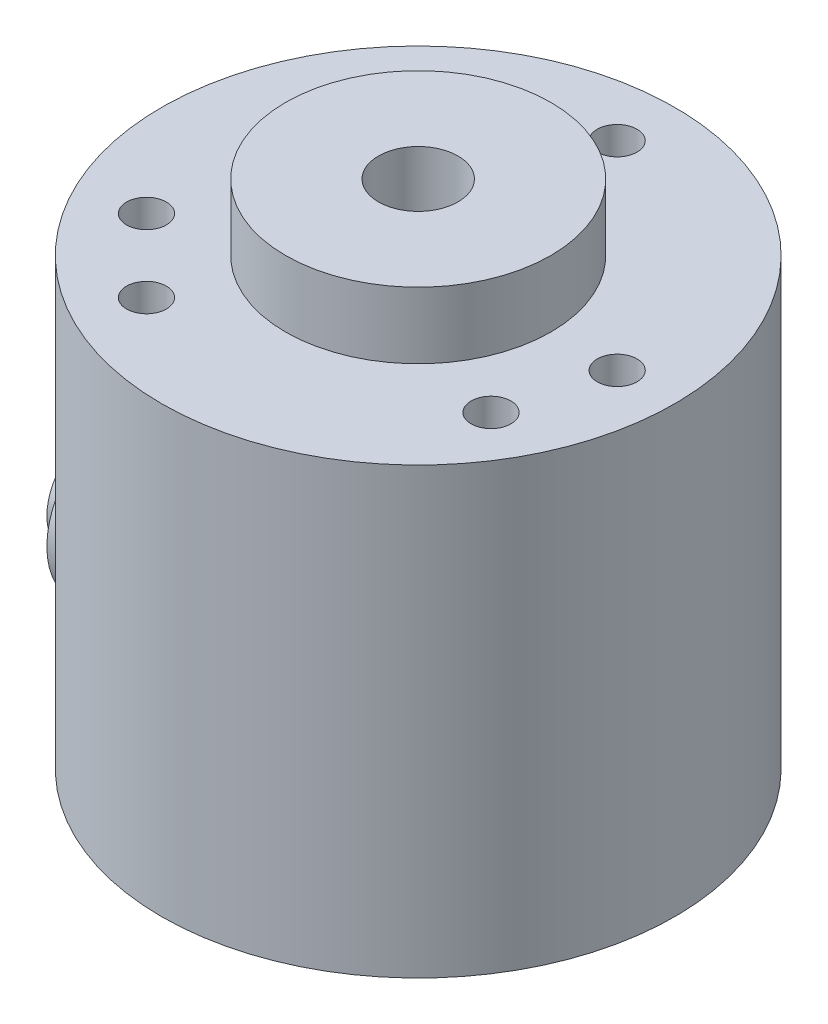
ISO-10303-21;
HEADER;
FILE_DESCRIPTION(('STEP AP214'),'2;1');
FILE_NAME('part.step','',(''),(''),'','','');
FILE_SCHEMA(('AUTOMOTIVE_DESIGN { 1 0 10303 214 1 1 1 1 }'));
ENDSEC;
DATA;
#1=APPLICATION_CONTEXT('core data for automotive mechanical design processes');
#2=APPLICATION_PROTOCOL_DEFINITION('international standard','automotive_design',2000,#1);
#3=PRODUCT_CONTEXT('',#1,'mechanical');
#4=PRODUCT('Part','Part','',(#3));
#5=PRODUCT_RELATED_PRODUCT_CATEGORY('part','',(#4));
#6=PRODUCT_DEFINITION_FORMATION('','',#4);
#7=PRODUCT_DEFINITION_CONTEXT('part definition',#1,'design');
#8=PRODUCT_DEFINITION('design','',#6,#7);
#9=PRODUCT_DEFINITION_SHAPE('','',#8);
#10=(LENGTH_UNIT() NAMED_UNIT(*) SI_UNIT(.MILLI.,.METRE.));
#11=(NAMED_UNIT(*) PLANE_ANGLE_UNIT() SI_UNIT($,.RADIAN.));
#12=(NAMED_UNIT(*) SI_UNIT($,.STERADIAN.) SOLID_ANGLE_UNIT());
#13=UNCERTAINTY_MEASURE_WITH_UNIT(LENGTH_MEASURE(1.E-05),#10,'distance_accuracy_value','');
#14=(GEOMETRIC_REPRESENTATION_CONTEXT(3) GLOBAL_UNCERTAINTY_ASSIGNED_CONTEXT((#13)) GLOBAL_UNIT_ASSIGNED_CONTEXT((#10,
#11,#12)) REPRESENTATION_CONTEXT('',''));
#15=CARTESIAN_POINT('',(0.,0.,0.));
#16=DIRECTION('',(0.,0.,1.));
#17=DIRECTION('',(1.,0.,0.));
#18=AXIS2_PLACEMENT_3D('',#15,#16,#17);
#19=CARTESIAN_POINT('',(0.,33.5,0.));
#20=DIRECTION('',(0.,-1.,0.));
#21=DIRECTION('',(0.,0.,-1.));
#22=AXIS2_PLACEMENT_3D('',#19,#20,#21);
#23=CYLINDRICAL_SURFACE('',#22,19.35);
#24=CARTESIAN_POINT('',(0.,33.5,0.));
#25=DIRECTION('',(0.,1.,0.));
#26=DIRECTION('',(0.,0.,1.));
#27=AXIS2_PLACEMENT_3D('',#24,#25,#26);
#28=CIRCLE('',#27,19.35);
#29=CARTESIAN_POINT('',(0.,33.5,19.35));
#30=VERTEX_POINT('',#29);
#31=EDGE_CURVE('E143',#30,#30,#28,.T.);
#32=ORIENTED_EDGE('',*,*,#31,.F.);
#33=EDGE_LOOP('',(#32));
#34=FACE_BOUND('',#33,.T.);
#35=CARTESIAN_POINT('',(0.,0.,0.));
#36=DIRECTION('',(0.,1.,0.));
#37=DIRECTION('',(0.,0.,1.));
#38=AXIS2_PLACEMENT_3D('',#35,#36,#37);
#39=CIRCLE('',#38,19.35);
#40=CARTESIAN_POINT('',(0.,0.,19.35));
#41=VERTEX_POINT('',#40);
#42=EDGE_CURVE('E139',#41,#41,#39,.T.);
#43=ORIENTED_EDGE('',*,*,#42,.T.);
#44=EDGE_LOOP('',(#43));
#45=FACE_BOUND('',#44,.T.);
#46=CARTESIAN_POINT('',(-18.3962632075104,6.5,6.));
#47=CARTESIAN_POINT('',(-18.396254948903,6.66417537004088,6.00001200529961));
#48=CARTESIAN_POINT('',(-18.3984651787003,6.8282454922487,5.9932604335798));
#49=CARTESIAN_POINT('',(-18.4072021365173,7.15519058262896,5.96637390385622));
#50=CARTESIAN_POINT('',(-18.4137291149144,7.31806548092261,5.94623816955152));
#51=CARTESIAN_POINT('',(-18.4395431290745,7.80307644137202,5.86593181871231));
#52=CARTESIAN_POINT('',(-18.4650636275965,8.121822583843,5.78586177226993));
#53=CARTESIAN_POINT('',(-18.5295806773833,8.74000419218241,5.57575313884579));
#54=CARTESIAN_POINT('',(-18.568553654058,9.03947235932613,5.44580192102297));
#55=CARTESIAN_POINT('',(-18.6555780280091,9.61260508691605,5.13975524381697));
#56=CARTESIAN_POINT('',(-18.7036309814575,9.8862652121807,4.96365187264122));
#57=CARTESIAN_POINT('',(-18.7793790352446,10.2761910269336,4.66565821293452));
#58=CARTESIAN_POINT('',(-18.8056668522791,10.4045135119431,4.55879891422907));
#59=CARTESIAN_POINT('',(-18.8585562269517,10.6517697615802,4.33481114272108));
#60=CARTESIAN_POINT('',(-18.8851576759668,10.7707066730199,4.21768613986108));
#61=CARTESIAN_POINT('',(-18.9379702475309,10.9985011549647,3.97383350483335));
#62=CARTESIAN_POINT('',(-18.9641811688197,11.1073536696047,3.84710111322587));
#63=CARTESIAN_POINT('',(-19.0154874240988,11.3141762714007,3.58490894986138));
#64=CARTESIAN_POINT('',(-19.0405831675409,11.4121503728405,3.44945242677941));
#65=CARTESIAN_POINT('',(-19.0895453488805,11.5986790109119,3.16744332694732));
#66=CARTESIAN_POINT('',(-19.1133709591726,11.6869692923059,3.02070868841922));
#67=CARTESIAN_POINT('',(-19.1584785361738,11.8507944074864,2.71998257769279));
#68=CARTESIAN_POINT('',(-19.1797614994372,11.9263342434527,2.56599398179304));
#69=CARTESIAN_POINT('',(-19.2191901764665,12.0640929447953,2.25173475929984));
#70=CARTESIAN_POINT('',(-19.2373351722515,12.1263087623509,2.09146270528627));
#71=CARTESIAN_POINT('',(-19.2699467294521,12.2368228242638,1.76589915912679));
#72=CARTESIAN_POINT('',(-19.2844149014037,12.2851271634178,1.60060990027504));
#73=CARTESIAN_POINT('',(-19.3088822968719,12.366164182969,1.27122516811284));
#74=CARTESIAN_POINT('',(-19.319002722112,12.3993210834394,1.10724301653924));
#75=CARTESIAN_POINT('',(-19.335102231438,12.4518320148317,0.776946530009174));
#76=CARTESIAN_POINT('',(-19.3410829828291,12.4711916028864,0.610633161547876));
#77=CARTESIAN_POINT('',(-19.3487391362864,12.4959440446351,0.276871426616334));
#78=CARTESIAN_POINT('',(-19.3504145425522,12.5013369119527,0.10942306125336));
#79=CARTESIAN_POINT('',(-19.349411905323,12.4981033706454,-0.225323468576094));
#80=CARTESIAN_POINT('',(-19.346733947728,12.4894772386411,-0.392621635941084));
#81=CARTESIAN_POINT('',(-19.3372669646729,12.4588250285184,-0.720080273127005));
#82=CARTESIAN_POINT('',(-19.3306217910395,12.4372677124184,-0.880289052068062));
#83=CARTESIAN_POINT('',(-19.3135169193132,12.3813386633211,-1.19830261973268));
#84=CARTESIAN_POINT('',(-19.3030559247748,12.3469625749891,-1.35610657239783));
#85=CARTESIAN_POINT('',(-19.2785982797616,12.2657046960965,-1.66812206542651));
#86=CARTESIAN_POINT('',(-19.2646027785349,12.218826970178,-1.82233475572503));
#87=CARTESIAN_POINT('',(-19.2334307746976,12.1129243271526,-2.12626151889554));
#88=CARTESIAN_POINT('',(-19.2162530750231,12.0538948379222,-2.27597387413932));
#89=CARTESIAN_POINT('',(-19.1789398049399,11.9233924766832,-2.57162004275753));
#90=CARTESIAN_POINT('',(-19.1587718621077,11.8517815921342,-2.71748881991415));
#91=CARTESIAN_POINT('',(-19.1161424092667,11.6971075664252,-3.00273298736432));
#92=CARTESIAN_POINT('',(-19.0936801135214,11.6140404984852,-3.14210612917045));
#93=CARTESIAN_POINT('',(-19.0470373631021,11.4370454937236,-3.41347701634848));
#94=CARTESIAN_POINT('',(-19.0228568489797,11.3431171810442,-3.54547450624832));
#95=CARTESIAN_POINT('',(-18.9733876175992,11.1450119054833,-3.80132115155472));
#96=CARTESIAN_POINT('',(-18.9480988656793,11.0408346219231,-3.92517005179866));
#97=CARTESIAN_POINT('',(-18.8959961338342,10.8183721835087,-4.16893268920621));
#98=CARTESIAN_POINT('',(-18.8691622812171,10.6996822197743,-4.28847304741261));
#99=CARTESIAN_POINT('',(-18.8157305868405,10.4526886304147,-4.5171416116123));
#100=CARTESIAN_POINT('',(-18.7891326724702,10.3243880860075,-4.62627312945854));
#101=CARTESIAN_POINT('',(-18.7368931770166,10.0588778615293,-4.83350403248794));
#102=CARTESIAN_POINT('',(-18.7112520687233,9.92166386645302,-4.93159801066302));
#103=CARTESIAN_POINT('',(-18.6616827005478,9.6393004889139,-5.11597616085845));
#104=CARTESIAN_POINT('',(-18.6377537755539,9.49415422687769,-5.20226493072066));
#105=CARTESIAN_POINT('',(-18.5920443458392,9.19512259769266,-5.36334592829184));
#106=CARTESIAN_POINT('',(-18.5702912164425,9.04115692577398,-5.43799701340734));
#107=CARTESIAN_POINT('',(-18.5299307133209,8.72712025173839,-5.5739752333766));
#108=CARTESIAN_POINT('',(-18.511322111085,8.5670516640174,-5.63530757430916));
#109=CARTESIAN_POINT('',(-18.4778410104203,8.24190993074761,-5.74413931778635));
#110=CARTESIAN_POINT('',(-18.4629681841243,8.07683722580682,-5.79163993431847));
#111=CARTESIAN_POINT('',(-18.4374520874409,7.74291741183855,-5.87236382870318));
#112=CARTESIAN_POINT('',(-18.4268086334969,7.57407046695071,-5.90558772617654));
#113=CARTESIAN_POINT('',(-18.410446134938,7.24069792323786,-5.95639618891658));
#114=CARTESIAN_POINT('',(-18.4045479657689,7.07626777887199,-5.97455054841904));
#115=CARTESIAN_POINT('',(-18.3971725878539,6.74631091124739,-5.99722310048295));
#116=CARTESIAN_POINT('',(-18.3956969039167,6.58078382949017,-6.00173658987553));
#117=CARTESIAN_POINT('',(-18.3972185033893,6.25002936635444,-5.99707067716109));
#118=CARTESIAN_POINT('',(-18.4002134982106,6.08480187495574,-5.98789828100756));
#119=CARTESIAN_POINT('',(-18.4105775118924,5.75574360442561,-5.95595642415295));
#120=CARTESIAN_POINT('',(-18.4179481479883,5.59191336443901,-5.93318193610512));
#121=CARTESIAN_POINT('',(-18.4365569254616,5.27160224335456,-5.87509722903779));
#122=CARTESIAN_POINT('',(-18.4476777414986,5.11504550453641,-5.84016637320586));
#123=CARTESIAN_POINT('',(-18.4734997139824,4.80545052581438,-5.75796517046525));
#124=CARTESIAN_POINT('',(-18.4882021408717,4.65241355554415,-5.71069044460148));
#125=CARTESIAN_POINT('',(-18.5207585282576,4.35094164169144,-5.60420373617969));
#126=CARTESIAN_POINT('',(-18.538611745803,4.20250562289144,-5.5449945672766));
#127=CARTESIAN_POINT('',(-18.5769810778139,3.91106105088298,-5.41505877897731));
#128=CARTESIAN_POINT('',(-18.5974981480293,3.76805446959002,-5.34432802348004));
#129=CARTESIAN_POINT('',(-18.6412438772546,3.48443103608206,-5.189716650557));
#130=CARTESIAN_POINT('',(-18.6645325789748,3.34399457304887,-5.10552209176353));
#131=CARTESIAN_POINT('',(-18.7126914984098,3.07065200225845,-4.9260839746664));
#132=CARTESIAN_POINT('',(-18.7375617711206,2.93774615666688,-4.83084003204853));
#133=CARTESIAN_POINT('',(-18.788224909642,2.68020358563239,-4.62988583843478));
#134=CARTESIAN_POINT('',(-18.8140181213318,2.55557001132072,-4.52417163681805));
#135=CARTESIAN_POINT('',(-18.8658318800139,2.3154019949827,-4.30299687180302));
#136=CARTESIAN_POINT('',(-18.8918523533,2.19986471627549,-4.18753937031102));
#137=CARTESIAN_POINT('',(-18.9445180961712,1.97398387955301,-3.94259570352941));
#138=CARTESIAN_POINT('',(-18.9711450323348,1.86404951764978,-3.81272781705758));
#139=CARTESIAN_POINT('',(-19.0231736013317,1.65553654441889,-3.54402089204944));
#140=CARTESIAN_POINT('',(-19.0485756698562,1.55695387765948,-3.40518508517582));
#141=CARTESIAN_POINT('',(-19.0974669632191,1.37177169675549,-3.11934029590192));
#142=CARTESIAN_POINT('',(-19.1209554687993,1.28517667998197,-2.9723282748938));
#143=CARTESIAN_POINT('',(-19.1653398646657,1.12471423846154,-2.67121579305387));
#144=CARTESIAN_POINT('',(-19.1862368309126,1.0508415266565,-2.51711831065112));
#145=CARTESIAN_POINT('',(-19.2247193790604,0.916862377818753,-2.20394558587916));
#146=CARTESIAN_POINT('',(-19.2423271948601,0.856662866973248,-2.04491292347666));
#147=CARTESIAN_POINT('',(-19.2739035600918,0.749916594538959,-1.72204452771519));
#148=CARTESIAN_POINT('',(-19.2878735623184,0.703364381838333,-1.55821074090085));
#149=CARTESIAN_POINT('',(-19.311778371148,0.624312397758581,-1.22690517053723));
#150=CARTESIAN_POINT('',(-19.3217134014161,0.591811847466743,-1.05943358917903));
#151=CARTESIAN_POINT('',(-19.3372572330195,0.541174605984937,-0.722135799377492));
#152=CARTESIAN_POINT('',(-19.3428661908677,0.5230373951434,-0.552309676345374));
#153=CARTESIAN_POINT('',(-19.3494539635469,0.501753239703157,-0.218670186747859));
#154=CARTESIAN_POINT('',(-19.3506141328141,0.49801911573299,-0.0548975815705274));
#155=CARTESIAN_POINT('',(-19.3487744375475,0.50395289128672,0.272439030238904));
#156=CARTESIAN_POINT('',(-19.3457731505526,0.51362537343109,0.436002946406095));
#157=CARTESIAN_POINT('',(-19.3356921749298,0.546284186194804,0.761594765711806));
#158=CARTESIAN_POINT('',(-19.3286142658401,0.569264707576776,0.923623307726984));
#159=CARTESIAN_POINT('',(-19.310570290588,0.628337943368595,1.2451129184919));
#160=CARTESIAN_POINT('',(-19.2996027728023,0.664435553271838,1.40457300542112));
#161=CARTESIAN_POINT('',(-19.274235542107,0.748890952451233,1.71776610218174));
#162=CARTESIAN_POINT('',(-19.2598806846842,0.797088999150475,1.87154589656528));
#163=CARTESIAN_POINT('',(-19.2280332171048,0.905587578441697,2.17449951761089));
#164=CARTESIAN_POINT('',(-19.2105394802423,0.965892457728167,2.3236716677401));
#165=CARTESIAN_POINT('',(-19.1728671578455,1.09811626889547,2.61637842015561));
#166=CARTESIAN_POINT('',(-19.1526892043363,1.17003246762718,2.75991433927457));
#167=CARTESIAN_POINT('',(-19.1101437872282,1.32499782561854,3.04056938773939));
#168=CARTESIAN_POINT('',(-19.0877754962391,1.40805119630645,3.17768606311041));
#169=CARTESIAN_POINT('',(-19.0406375756321,1.58765516784183,3.4490881471848));
#170=CARTESIAN_POINT('',(-19.015812885917,1.68456225252474,3.58312854113504));
#171=CARTESIAN_POINT('',(-18.9650735149456,1.88899983084006,3.84265547317531));
#172=CARTESIAN_POINT('',(-18.9391584305068,1.99653427420545,3.96813880146716));
#173=CARTESIAN_POINT('',(-18.8608031181945,2.33403366776519,4.33053796879568));
#174=CARTESIAN_POINT('',(-18.8077160463606,2.57902931951566,4.55360586273766));
#175=CARTESIAN_POINT('',(-18.7038596461145,3.11150005961589,4.96331328351969));
#176=CARTESIAN_POINT('',(-18.6532215419244,3.40009614390194,5.1485348240421));
#177=CARTESIAN_POINT('',(-18.5849684365144,3.85404571261181,5.3877908088131));
#178=CARTESIAN_POINT('',(-18.5634964686937,4.00891787372372,5.46112857085053));
#179=CARTESIAN_POINT('',(-18.5237604674547,4.32475304960708,5.594429893224));
#180=CARTESIAN_POINT('',(-18.5054962312538,4.4857156785762,5.65439429904547));
#181=CARTESIAN_POINT('',(-18.4742507757006,4.79784717787475,5.75561596963127));
#182=CARTESIAN_POINT('',(-18.4609422412813,4.94859576266175,5.79807030839954));
#183=CARTESIAN_POINT('',(-18.4378375413789,5.25319954578542,5.87112206005744));
#184=CARTESIAN_POINT('',(-18.4280423123621,5.40705556087646,5.90171631183406));
#185=CARTESIAN_POINT('',(-18.4044065992556,5.87174732010516,5.97522335782476));
#186=CARTESIAN_POINT('',(-18.3962789995078,6.18606607714751,5.99997704362841));
#187=CARTESIAN_POINT('',(-18.3962632075104,6.5,6.));
#188=B_SPLINE_CURVE_WITH_KNOTS('',3,(#46,#47,#48,#49,#50,#51,#52,#53,#54,#55,#56,#57,#58,#59,
#60,#61,#62,#63,#64,#65,#66,#67,#68,#69,#70,#71,#72,#73,#74,#75,#76,#77,#78,#79,#80,#81,#82,#83,
#84,#85,#86,#87,#88,#89,#90,#91,#92,#93,#94,#95,#96,#97,#98,#99,#100,#101,#102,#103,#104,#105,
#106,#107,#108,#109,#110,#111,#112,#113,#114,#115,#116,#117,#118,#119,#120,#121,#122,#123,#124,
#125,#126,#127,#128,#129,#130,#131,#132,#133,#134,#135,#136,#137,#138,#139,#140,#141,#142,#143,
#144,#145,#146,#147,#148,#149,#150,#151,#152,#153,#154,#155,#156,#157,#158,#159,#160,#161,#162,
#163,#164,#165,#166,#167,#168,#169,#170,#171,#172,#173,#174,#175,#176,#177,#178,#179,#180,#181,
#182,#183,#184,#185,#186,#187),.UNSPECIFIED.,.T.,.F.,(4,2,2,2,2,2,2,2,2,2,2,2,2,2,2,2,2,2,2,2,2,
2,2,2,2,2,2,2,2,2,2,2,2,2,2,2,2,2,2,2,2,2,2,2,2,2,2,2,2,2,2,2,2,2,2,2,2,2,2,2,2,2,2,2,2,2,2,2,2,
2,4),(0.,0.492171175392721,0.984370899922369,1.96810780033993,2.95012944559755,3.93231954755799,
4.43898730846662,4.94548446467289,5.45223419700558,5.95879630585714,6.47685540351436,
6.99471078448901,7.51268449676961,8.03043093171657,8.53262273712306,9.03461216063982,
9.53660109450081,10.0385801233174,10.5233773182698,11.0083393793032,11.4931439570349,
11.9781312778707,12.4688151184163,12.9596675682201,13.4505370092605,13.9414218139381,
14.4525666040729,14.9635482133608,15.4747790595705,15.9858102234731,16.5026241508755,
17.0192356990994,17.5358018915089,18.0523456622768,18.5483319133101,19.0444891535186,
19.5403924925708,20.0364792315154,20.5182985900353,21.0002891054628,21.4821661198163,
21.9642165045896,22.4598272179071,22.9554551744829,23.4512708582271,23.9469313042488,
24.4629825346727,24.9788488282658,25.4949081364029,26.0107524635159,26.5229725223395,
27.0349877065409,27.5469745050415,28.0589427795143,28.5498040295409,29.0408331062058,
29.5316479998103,30.0226462613205,30.5074753399706,30.9924787982368,31.4773682591767,
31.9624415967937,32.4636145412465,32.9649744556991,33.9669643883183,35.0014884726831,
35.5190409423783,36.0365606822793,36.5075596448905,36.9786840584321,37.9198071255979),.UNSPECIFIED.);
#189=CARTESIAN_POINT('',(-18.3962632075104,6.5,6.));
#190=VERTEX_POINT('',#189);
#191=EDGE_CURVE('E55',#190,#190,#188,.T.);
#192=ORIENTED_EDGE('',*,*,#191,.F.);
#193=EDGE_LOOP('',(#192));
#194=FACE_BOUND('',#193,.T.);
#195=ADVANCED_FACE('F51',(#34,#45,#194),#23,.T.);
#196=CARTESIAN_POINT('',(0.,33.5,0.));
#197=DIRECTION('',(0.,1.,0.));
#198=DIRECTION('',(0.,0.,1.));
#199=AXIS2_PLACEMENT_3D('',#196,#197,#198);
#200=PLANE('',#199);
#201=CARTESIAN_POINT('',(0.,33.5,-15.));
#202=DIRECTION('',(0.,1.,0.));
#203=DIRECTION('',(0.,0.,1.));
#204=AXIS2_PLACEMENT_3D('',#201,#202,#203);
#205=CIRCLE('',#204,1.5);
#206=CARTESIAN_POINT('',(0.,33.5,-13.5));
#207=VERTEX_POINT('',#206);
#208=EDGE_CURVE('E105',#207,#207,#205,.T.);
#209=ORIENTED_EDGE('',*,*,#208,.F.);
#210=EDGE_LOOP('',(#209));
#211=FACE_BOUND('',#210,.T.);
#212=CARTESIAN_POINT('',(-7.50000000000006,33.5,12.9903810567665));
#213=DIRECTION('',(0.,1.,0.));
#214=DIRECTION('',(0.,0.,1.));
#215=AXIS2_PLACEMENT_3D('',#212,#213,#214);
#216=CIRCLE('',#215,1.5);
#217=CARTESIAN_POINT('',(-7.50000000000006,33.5,14.4903810567665));
#218=VERTEX_POINT('',#217);
#219=EDGE_CURVE('E96',#218,#218,#216,.T.);
#220=ORIENTED_EDGE('',*,*,#219,.F.);
#221=EDGE_LOOP('',(#220));
#222=FACE_BOUND('',#221,.T.);
#223=CARTESIAN_POINT('',(-12.9903810567666,33.5,7.49999999999992));
#224=DIRECTION('',(0.,1.,0.));
#225=DIRECTION('',(0.,0.,1.));
#226=AXIS2_PLACEMENT_3D('',#223,#224,#225);
#227=CIRCLE('',#226,1.5);
#228=CARTESIAN_POINT('',(-12.9903810567666,33.5,8.99999999999993));
#229=VERTEX_POINT('',#228);
#230=EDGE_CURVE('E121',#229,#229,#227,.T.);
#231=ORIENTED_EDGE('',*,*,#230,.F.);
#232=EDGE_LOOP('',(#231));
#233=FACE_BOUND('',#232,.T.);
#234=CARTESIAN_POINT('',(12.9903810567666,33.5,7.50000000000001));
#235=DIRECTION('',(0.,1.,0.));
#236=DIRECTION('',(0.,0.,1.));
#237=AXIS2_PLACEMENT_3D('',#234,#235,#236);
#238=CIRCLE('',#237,1.5);
#239=CARTESIAN_POINT('',(12.9903810567666,33.5,9.00000000000001));
#240=VERTEX_POINT('',#239);
#241=EDGE_CURVE('E112',#240,#240,#238,.T.);
#242=ORIENTED_EDGE('',*,*,#241,.F.);
#243=EDGE_LOOP('',(#242));
#244=FACE_BOUND('',#243,.T.);
#245=CARTESIAN_POINT('',(-7.49999999999993,33.5,-12.9903810567666));
#246=DIRECTION('',(0.,1.,0.));
#247=DIRECTION('',(0.,0.,1.));
#248=AXIS2_PLACEMENT_3D('',#245,#246,#247);
#249=CIRCLE('',#248,1.5);
#250=CARTESIAN_POINT('',(-7.49999999999993,33.5,-11.4903810567666));
#251=VERTEX_POINT('',#250);
#252=EDGE_CURVE('E88',#251,#251,#249,.T.);
#253=ORIENTED_EDGE('',*,*,#252,.F.);
#254=EDGE_LOOP('',(#253));
#255=FACE_BOUND('',#254,.T.);
#256=CARTESIAN_POINT('',(15.,33.5,0.));
#257=DIRECTION('',(0.,1.,0.));
#258=DIRECTION('',(0.,0.,1.));
#259=AXIS2_PLACEMENT_3D('',#256,#257,#258);
#260=CIRCLE('',#259,1.5);
#261=CARTESIAN_POINT('',(15.,33.5,1.5));
#262=VERTEX_POINT('',#261);
#263=EDGE_CURVE('E116',#262,#262,#260,.T.);
#264=ORIENTED_EDGE('',*,*,#263,.F.);
#265=EDGE_LOOP('',(#264));
#266=FACE_BOUND('',#265,.T.);
#267=CARTESIAN_POINT('',(0.,33.5,0.));
#268=DIRECTION('',(0.,1.,0.));
#269=DIRECTION('',(0.,0.,1.));
#270=AXIS2_PLACEMENT_3D('',#267,#268,#269);
#271=CIRCLE('',#270,10.);
#272=CARTESIAN_POINT('',(0.,33.5,10.));
#273=VERTEX_POINT('',#272);
#274=EDGE_CURVE('E71',#273,#273,#271,.T.);
#275=ORIENTED_EDGE('',*,*,#274,.F.);
#276=EDGE_LOOP('',(#275));
#277=FACE_BOUND('',#276,.T.);
#278=ORIENTED_EDGE('',*,*,#31,.T.);
#279=EDGE_LOOP('',(#278));
#280=FACE_BOUND('',#279,.T.);
#281=ADVANCED_FACE('F157',(#211,#222,#233,#244,#255,#266,#277,#280),#200,.T.);
#282=CARTESIAN_POINT('',(0.,0.,0.));
#283=DIRECTION('',(0.,1.,0.));
#284=DIRECTION('',(0.,0.,1.));
#285=AXIS2_PLACEMENT_3D('',#282,#283,#284);
#286=PLANE('',#285);
#287=ORIENTED_EDGE('',*,*,#42,.F.);
#288=EDGE_LOOP('',(#287));
#289=FACE_BOUND('',#288,.T.);
#290=ADVANCED_FACE('F154',(#289),#286,.F.);
#291=CARTESIAN_POINT('',(0.,38.5,0.));
#292=DIRECTION('',(0.,-1.,0.));
#293=DIRECTION('',(0.,0.,-1.));
#294=AXIS2_PLACEMENT_3D('',#291,#292,#293);
#295=CYLINDRICAL_SURFACE('',#294,10.);
#296=CARTESIAN_POINT('',(0.,38.5,0.));
#297=DIRECTION('',(0.,1.,0.));
#298=DIRECTION('',(0.,0.,1.));
#299=AXIS2_PLACEMENT_3D('',#296,#297,#298);
#300=CIRCLE('',#299,10.);
#301=CARTESIAN_POINT('',(0.,38.5,10.));
#302=VERTEX_POINT('',#301);
#303=EDGE_CURVE('E132',#302,#302,#300,.T.);
#304=ORIENTED_EDGE('',*,*,#303,.F.);
#305=EDGE_LOOP('',(#304));
#306=FACE_BOUND('',#305,.T.);
#307=ORIENTED_EDGE('',*,*,#274,.T.);
#308=EDGE_LOOP('',(#307));
#309=FACE_BOUND('',#308,.T.);
#310=ADVANCED_FACE('F156',(#306,#309),#295,.T.);
#311=CARTESIAN_POINT('',(0.,38.5,0.));
#312=DIRECTION('',(0.,1.,0.));
#313=DIRECTION('',(0.,0.,1.));
#314=AXIS2_PLACEMENT_3D('',#311,#312,#313);
#315=PLANE('',#314);
#316=CARTESIAN_POINT('',(0.,38.5,0.));
#317=DIRECTION('',(0.,1.,0.));
#318=DIRECTION('',(0.,0.,1.));
#319=AXIS2_PLACEMENT_3D('',#316,#317,#318);
#320=CIRCLE('',#319,3.);
#321=CARTESIAN_POINT('',(0.,38.5,3.));
#322=VERTEX_POINT('',#321);
#323=EDGE_CURVE('E79',#322,#322,#320,.T.);
#324=ORIENTED_EDGE('',*,*,#323,.F.);
#325=EDGE_LOOP('',(#324));
#326=FACE_BOUND('',#325,.T.);
#327=ORIENTED_EDGE('',*,*,#303,.T.);
#328=EDGE_LOOP('',(#327));
#329=FACE_BOUND('',#328,.T.);
#330=ADVANCED_FACE('F161',(#326,#329),#315,.T.);
#331=CARTESIAN_POINT('',(15.,30.5,0.));
#332=DIRECTION('',(0.,1.,0.));
#333=DIRECTION('',(0.,0.,1.));
#334=AXIS2_PLACEMENT_3D('',#331,#332,#333);
#335=CYLINDRICAL_SURFACE('',#334,1.5);
#336=CARTESIAN_POINT('',(15.,30.5,0.));
#337=DIRECTION('',(0.,1.,0.));
#338=DIRECTION('',(0.,0.,1.));
#339=AXIS2_PLACEMENT_3D('',#336,#337,#338);
#340=CIRCLE('',#339,1.5);
#341=CARTESIAN_POINT('',(15.,30.5,1.5));
#342=VERTEX_POINT('',#341);
#343=EDGE_CURVE('E128',#342,#342,#340,.T.);
#344=ORIENTED_EDGE('',*,*,#343,.F.);
#345=EDGE_LOOP('',(#344));
#346=FACE_BOUND('',#345,.T.);
#347=ORIENTED_EDGE('',*,*,#263,.T.);
#348=EDGE_LOOP('',(#347));
#349=FACE_BOUND('',#348,.T.);
#350=ADVANCED_FACE('F294',(#346,#349),#335,.F.);
#351=CARTESIAN_POINT('',(15.,30.5,0.));
#352=DIRECTION('',(0.,1.,0.));
#353=DIRECTION('',(0.,0.,1.));
#354=AXIS2_PLACEMENT_3D('',#351,#352,#353);
#355=PLANE('',#354);
#356=ORIENTED_EDGE('',*,*,#343,.T.);
#357=EDGE_LOOP('',(#356));
#358=FACE_BOUND('',#357,.T.);
#359=ADVANCED_FACE('F256',(#358),#355,.T.);
#360=CARTESIAN_POINT('',(-7.49999999999993,30.5,-12.9903810567666));
#361=DIRECTION('',(0.,1.,0.));
#362=DIRECTION('',(0.,0.,1.));
#363=AXIS2_PLACEMENT_3D('',#360,#361,#362);
#364=CYLINDRICAL_SURFACE('',#363,1.5);
#365=CARTESIAN_POINT('',(-7.49999999999993,30.5,-12.9903810567666));
#366=DIRECTION('',(0.,1.,0.));
#367=DIRECTION('',(0.,0.,1.));
#368=AXIS2_PLACEMENT_3D('',#365,#366,#367);
#369=CIRCLE('',#368,1.5);
#370=CARTESIAN_POINT('',(-7.49999999999993,30.5,-11.4903810567666));
#371=VERTEX_POINT('',#370);
#372=EDGE_CURVE('E84',#371,#371,#369,.T.);
#373=ORIENTED_EDGE('',*,*,#372,.F.);
#374=EDGE_LOOP('',(#373));
#375=FACE_BOUND('',#374,.T.);
#376=ORIENTED_EDGE('',*,*,#252,.T.);
#377=EDGE_LOOP('',(#376));
#378=FACE_BOUND('',#377,.T.);
#379=ADVANCED_FACE('F252',(#375,#378),#364,.F.);
#380=CARTESIAN_POINT('',(-7.49999999999993,30.5,-12.9903810567666));
#381=DIRECTION('',(0.,1.,0.));
#382=DIRECTION('',(0.,0.,1.));
#383=AXIS2_PLACEMENT_3D('',#380,#381,#382);
#384=PLANE('',#383);
#385=ORIENTED_EDGE('',*,*,#372,.T.);
#386=EDGE_LOOP('',(#385));
#387=FACE_BOUND('',#386,.T.);
#388=ADVANCED_FACE('F255',(#387),#384,.T.);
#389=CARTESIAN_POINT('',(12.9903810567666,30.5,7.50000000000001));
#390=DIRECTION('',(0.,1.,0.));
#391=DIRECTION('',(0.,0.,1.));
#392=AXIS2_PLACEMENT_3D('',#389,#390,#391);
#393=CYLINDRICAL_SURFACE('',#392,1.5);
#394=CARTESIAN_POINT('',(12.9903810567666,30.5,7.50000000000001));
#395=DIRECTION('',(0.,1.,0.));
#396=DIRECTION('',(0.,0.,1.));
#397=AXIS2_PLACEMENT_3D('',#394,#395,#396);
#398=CIRCLE('',#397,1.5);
#399=CARTESIAN_POINT('',(12.9903810567666,30.5,9.00000000000001));
#400=VERTEX_POINT('',#399);
#401=EDGE_CURVE('E117',#400,#400,#398,.T.);
#402=ORIENTED_EDGE('',*,*,#401,.F.);
#403=EDGE_LOOP('',(#402));
#404=FACE_BOUND('',#403,.T.);
#405=ORIENTED_EDGE('',*,*,#241,.T.);
#406=EDGE_LOOP('',(#405));
#407=FACE_BOUND('',#406,.T.);
#408=ADVANCED_FACE('F260',(#404,#407),#393,.F.);
#409=CARTESIAN_POINT('',(12.9903810567666,30.5,7.50000000000001));
#410=DIRECTION('',(0.,1.,0.));
#411=DIRECTION('',(0.,0.,1.));
#412=AXIS2_PLACEMENT_3D('',#409,#410,#411);
#413=PLANE('',#412);
#414=ORIENTED_EDGE('',*,*,#401,.T.);
#415=EDGE_LOOP('',(#414));
#416=FACE_BOUND('',#415,.T.);
#417=ADVANCED_FACE('F280',(#416),#413,.T.);
#418=CARTESIAN_POINT('',(-12.9903810567666,30.5,7.49999999999992));
#419=DIRECTION('',(0.,1.,0.));
#420=DIRECTION('',(0.,0.,1.));
#421=AXIS2_PLACEMENT_3D('',#418,#419,#420);
#422=CYLINDRICAL_SURFACE('',#421,1.5);
#423=CARTESIAN_POINT('',(-12.9903810567666,30.5,7.49999999999992));
#424=DIRECTION('',(0.,1.,0.));
#425=DIRECTION('',(0.,0.,1.));
#426=AXIS2_PLACEMENT_3D('',#423,#424,#425);
#427=CIRCLE('',#426,1.5);
#428=CARTESIAN_POINT('',(-12.9903810567666,30.5,8.99999999999993));
#429=VERTEX_POINT('',#428);
#430=EDGE_CURVE('E100',#429,#429,#427,.T.);
#431=ORIENTED_EDGE('',*,*,#430,.F.);
#432=EDGE_LOOP('',(#431));
#433=FACE_BOUND('',#432,.T.);
#434=ORIENTED_EDGE('',*,*,#230,.T.);
#435=EDGE_LOOP('',(#434));
#436=FACE_BOUND('',#435,.T.);
#437=ADVANCED_FACE('F284',(#433,#436),#422,.F.);
#438=CARTESIAN_POINT('',(-12.9903810567666,30.5,7.49999999999992));
#439=DIRECTION('',(0.,1.,0.));
#440=DIRECTION('',(0.,0.,1.));
#441=AXIS2_PLACEMENT_3D('',#438,#439,#440);
#442=PLANE('',#441);
#443=ORIENTED_EDGE('',*,*,#430,.T.);
#444=EDGE_LOOP('',(#443));
#445=FACE_BOUND('',#444,.T.);
#446=ADVANCED_FACE('F266',(#445),#442,.T.);
#447=CARTESIAN_POINT('',(-7.50000000000006,30.5,12.9903810567665));
#448=DIRECTION('',(0.,1.,0.));
#449=DIRECTION('',(0.,0.,1.));
#450=AXIS2_PLACEMENT_3D('',#447,#448,#449);
#451=CYLINDRICAL_SURFACE('',#450,1.5);
#452=CARTESIAN_POINT('',(-7.50000000000006,30.5,12.9903810567665));
#453=DIRECTION('',(0.,1.,0.));
#454=DIRECTION('',(0.,0.,1.));
#455=AXIS2_PLACEMENT_3D('',#452,#453,#454);
#456=CIRCLE('',#455,1.5);
#457=CARTESIAN_POINT('',(-7.50000000000006,30.5,14.4903810567665));
#458=VERTEX_POINT('',#457);
#459=EDGE_CURVE('E101',#458,#458,#456,.T.);
#460=ORIENTED_EDGE('',*,*,#459,.F.);
#461=EDGE_LOOP('',(#460));
#462=FACE_BOUND('',#461,.T.);
#463=ORIENTED_EDGE('',*,*,#219,.T.);
#464=EDGE_LOOP('',(#463));
#465=FACE_BOUND('',#464,.T.);
#466=ADVANCED_FACE('F262',(#462,#465),#451,.F.);
#467=CARTESIAN_POINT('',(-7.50000000000006,30.5,12.9903810567665));
#468=DIRECTION('',(0.,1.,0.));
#469=DIRECTION('',(0.,0.,1.));
#470=AXIS2_PLACEMENT_3D('',#467,#468,#469);
#471=PLANE('',#470);
#472=ORIENTED_EDGE('',*,*,#459,.T.);
#473=EDGE_LOOP('',(#472));
#474=FACE_BOUND('',#473,.T.);
#475=ADVANCED_FACE('F265',(#474),#471,.T.);
#476=CARTESIAN_POINT('',(0.,30.5,-15.));
#477=DIRECTION('',(0.,1.,0.));
#478=DIRECTION('',(0.,0.,1.));
#479=AXIS2_PLACEMENT_3D('',#476,#477,#478);
#480=CYLINDRICAL_SURFACE('',#479,1.5);
#481=CARTESIAN_POINT('',(0.,30.5,-15.));
#482=DIRECTION('',(0.,1.,0.));
#483=DIRECTION('',(0.,0.,1.));
#484=AXIS2_PLACEMENT_3D('',#481,#482,#483);
#485=CIRCLE('',#484,1.5);
#486=CARTESIAN_POINT('',(0.,30.5,-13.5));
#487=VERTEX_POINT('',#486);
#488=EDGE_CURVE('E92',#487,#487,#485,.T.);
#489=ORIENTED_EDGE('',*,*,#488,.F.);
#490=EDGE_LOOP('',(#489));
#491=FACE_BOUND('',#490,.T.);
#492=ORIENTED_EDGE('',*,*,#208,.T.);
#493=EDGE_LOOP('',(#492));
#494=FACE_BOUND('',#493,.T.);
#495=ADVANCED_FACE('F270',(#491,#494),#480,.F.);
#496=CARTESIAN_POINT('',(0.,30.5,-15.));
#497=DIRECTION('',(0.,1.,0.));
#498=DIRECTION('',(0.,0.,1.));
#499=AXIS2_PLACEMENT_3D('',#496,#497,#498);
#500=PLANE('',#499);
#501=ORIENTED_EDGE('',*,*,#488,.T.);
#502=EDGE_LOOP('',(#501));
#503=FACE_BOUND('',#502,.T.);
#504=ADVANCED_FACE('F250',(#503),#500,.T.);
#505=CARTESIAN_POINT('',(0.,32.5,0.));
#506=DIRECTION('',(0.,1.,0.));
#507=DIRECTION('',(0.,0.,1.));
#508=AXIS2_PLACEMENT_3D('',#505,#506,#507);
#509=CYLINDRICAL_SURFACE('',#508,3.);
#510=CARTESIAN_POINT('',(0.,32.5,0.));
#511=DIRECTION('',(0.,1.,0.));
#512=DIRECTION('',(0.,0.,1.));
#513=AXIS2_PLACEMENT_3D('',#510,#511,#512);
#514=CIRCLE('',#513,3.);
#515=CARTESIAN_POINT('',(0.,32.5,3.));
#516=VERTEX_POINT('',#515);
#517=EDGE_CURVE('E80',#516,#516,#514,.T.);
#518=ORIENTED_EDGE('',*,*,#517,.F.);
#519=EDGE_LOOP('',(#518));
#520=FACE_BOUND('',#519,.T.);
#521=ORIENTED_EDGE('',*,*,#323,.T.);
#522=EDGE_LOOP('',(#521));
#523=FACE_BOUND('',#522,.T.);
#524=ADVANCED_FACE('F247',(#520,#523),#509,.F.);
#525=CARTESIAN_POINT('',(0.,32.5,0.));
#526=DIRECTION('',(0.,1.,0.));
#527=DIRECTION('',(0.,0.,1.));
#528=AXIS2_PLACEMENT_3D('',#525,#526,#527);
#529=PLANE('',#528);
#530=ORIENTED_EDGE('',*,*,#517,.T.);
#531=EDGE_LOOP('',(#530));
#532=FACE_BOUND('',#531,.T.);
#533=ADVANCED_FACE('F202',(#532),#529,.T.);
#534=CARTESIAN_POINT('',(-22.,6.5,0.));
#535=DIRECTION('',(1.,0.,0.));
#536=DIRECTION('',(0.,0.,-1.));
#537=AXIS2_PLACEMENT_3D('',#534,#535,#536);
#538=PLANE('',#537);
#539=CARTESIAN_POINT('',(-22.,6.5,0.));
#540=DIRECTION('',(-1.,0.,0.));
#541=DIRECTION('',(0.,0.,1.));
#542=AXIS2_PLACEMENT_3D('',#539,#540,#541);
#543=CIRCLE('',#542,4.);
#544=CARTESIAN_POINT('',(-22.,6.5,4.));
#545=VERTEX_POINT('',#544);
#546=EDGE_CURVE('E10',#545,#545,#543,.T.);
#547=ORIENTED_EDGE('',*,*,#546,.F.);
#548=EDGE_LOOP('',(#547));
#549=FACE_BOUND('',#548,.T.);
#550=CARTESIAN_POINT('',(-22.,6.5,0.));
#551=DIRECTION('',(1.,0.,0.));
#552=DIRECTION('',(0.,0.,-1.));
#553=AXIS2_PLACEMENT_3D('',#550,#551,#552);
#554=CIRCLE('',#553,6.);
#555=CARTESIAN_POINT('',(-22.,6.5,-6.));
#556=VERTEX_POINT('',#555);
#557=EDGE_CURVE('E75',#556,#556,#554,.T.);
#558=ORIENTED_EDGE('',*,*,#557,.F.);
#559=EDGE_LOOP('',(#558));
#560=FACE_BOUND('',#559,.T.);
#561=ADVANCED_FACE('F211',(#549,#560),#538,.F.);
#562=CARTESIAN_POINT('',(19.351,6.5,0.));
#563=DIRECTION('',(-1.,0.,0.));
#564=DIRECTION('',(0.,0.,1.));
#565=AXIS2_PLACEMENT_3D('',#562,#563,#564);
#566=CYLINDRICAL_SURFACE('',#565,6.);
#567=ORIENTED_EDGE('',*,*,#557,.T.);
#568=EDGE_LOOP('',(#567));
#569=FACE_BOUND('',#568,.T.);
#570=ORIENTED_EDGE('',*,*,#191,.T.);
#571=EDGE_LOOP('',(#570));
#572=FACE_BOUND('',#571,.T.);
#573=ADVANCED_FACE('F206',(#569,#572),#566,.T.);
#574=CARTESIAN_POINT('',(-24.,6.5,0.));
#575=DIRECTION('',(1.,0.,0.));
#576=DIRECTION('',(0.,0.,-1.));
#577=AXIS2_PLACEMENT_3D('',#574,#575,#576);
#578=CYLINDRICAL_SURFACE('',#577,4.);
#579=CARTESIAN_POINT('',(-24.,6.5,0.));
#580=DIRECTION('',(-1.,0.,0.));
#581=DIRECTION('',(0.,0.,1.));
#582=AXIS2_PLACEMENT_3D('',#579,#580,#581);
#583=CIRCLE('',#582,4.);
#584=CARTESIAN_POINT('',(-24.,6.5,4.));
#585=VERTEX_POINT('',#584);
#586=EDGE_CURVE('E74',#585,#585,#583,.T.);
#587=ORIENTED_EDGE('',*,*,#586,.F.);
#588=EDGE_LOOP('',(#587));
#589=FACE_BOUND('',#588,.T.);
#590=ORIENTED_EDGE('',*,*,#546,.T.);
#591=EDGE_LOOP('',(#590));
#592=FACE_BOUND('',#591,.T.);
#593=ADVANCED_FACE('F210',(#589,#592),#578,.T.);
#594=CARTESIAN_POINT('',(-24.,6.5,0.));
#595=DIRECTION('',(-1.,0.,0.));
#596=DIRECTION('',(0.,0.,1.));
#597=AXIS2_PLACEMENT_3D('',#594,#595,#596);
#598=PLANE('',#597);
#599=ORIENTED_EDGE('',*,*,#586,.T.);
#600=EDGE_LOOP('',(#599));
#601=FACE_BOUND('',#600,.T.);
#602=ADVANCED_FACE('F226',(#601),#598,.T.);
#603=CLOSED_SHELL('',(#195,#281,#290,#310,#330,#350,#359,#379,#388,#408,#417,#437,#446,#466,
#475,#495,#504,#524,#533,#561,#573,#593,#602));
#604=MANIFOLD_SOLID_BREP('B2',#603);
#605=ADVANCED_BREP_SHAPE_REPRESENTATION('',(#18,#604),#14);
#606=SHAPE_DEFINITION_REPRESENTATION(#9,#605);
ENDSEC;
END-ISO-10303-21;
